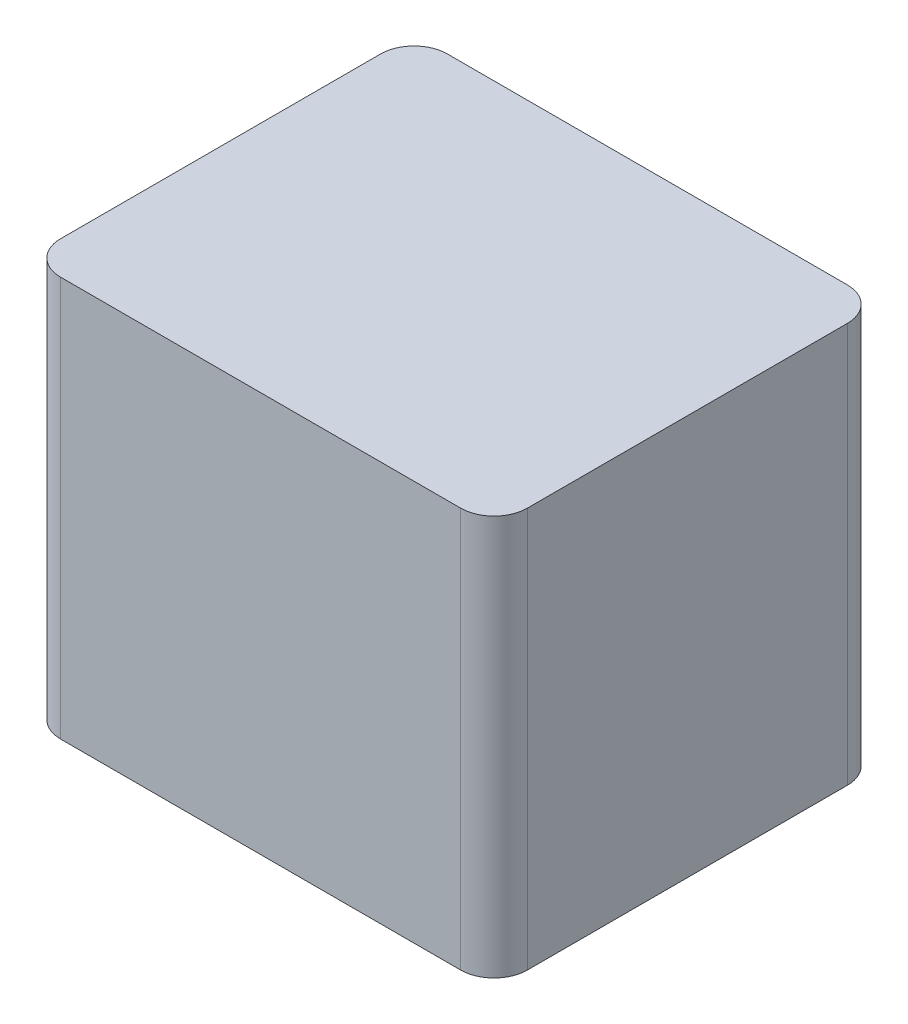
ISO-10303-21;
HEADER;
FILE_DESCRIPTION(('STEP AP214'),'2;1');
FILE_NAME('part.step','',(''),(''),'','','');
FILE_SCHEMA(('AUTOMOTIVE_DESIGN { 1 0 10303 214 1 1 1 1 }'));
ENDSEC;
DATA;
#1=APPLICATION_CONTEXT('core data for automotive mechanical design processes');
#2=APPLICATION_PROTOCOL_DEFINITION('international standard','automotive_design',2000,#1);
#3=PRODUCT_CONTEXT('',#1,'mechanical');
#4=PRODUCT('Part','Part','',(#3));
#5=PRODUCT_RELATED_PRODUCT_CATEGORY('part','',(#4));
#6=PRODUCT_DEFINITION_FORMATION('','',#4);
#7=PRODUCT_DEFINITION_CONTEXT('part definition',#1,'design');
#8=PRODUCT_DEFINITION('design','',#6,#7);
#9=PRODUCT_DEFINITION_SHAPE('','',#8);
#10=(LENGTH_UNIT() NAMED_UNIT(*) SI_UNIT(.MILLI.,.METRE.));
#11=(NAMED_UNIT(*) PLANE_ANGLE_UNIT() SI_UNIT($,.RADIAN.));
#12=(NAMED_UNIT(*) SI_UNIT($,.STERADIAN.) SOLID_ANGLE_UNIT());
#13=UNCERTAINTY_MEASURE_WITH_UNIT(LENGTH_MEASURE(1.E-05),#10,'distance_accuracy_value','');
#14=(GEOMETRIC_REPRESENTATION_CONTEXT(3) GLOBAL_UNCERTAINTY_ASSIGNED_CONTEXT((#13)) GLOBAL_UNIT_ASSIGNED_CONTEXT((#10,
#11,#12)) REPRESENTATION_CONTEXT('',''));
#15=CARTESIAN_POINT('',(0.,0.,0.));
#16=DIRECTION('',(0.,0.,1.));
#17=DIRECTION('',(1.,0.,0.));
#18=AXIS2_PLACEMENT_3D('',#15,#16,#17);
#19=CARTESIAN_POINT('',(-30.,30.,24.));
#20=DIRECTION('',(0.,-1.,0.));
#21=DIRECTION('',(0.,0.,-1.));
#22=AXIS2_PLACEMENT_3D('',#19,#20,#21);
#23=CYLINDRICAL_SURFACE('',#22,5.);
#24=CARTESIAN_POINT('',(-30.,-30.,24.));
#25=DIRECTION('',(0.,1.,0.));
#26=DIRECTION('',(0.,0.,-1.));
#27=AXIS2_PLACEMENT_3D('',#24,#25,#26);
#28=CIRCLE('',#27,5.);
#29=CARTESIAN_POINT('',(-35.,-30.,24.));
#30=VERTEX_POINT('',#29);
#31=CARTESIAN_POINT('',(-30.,-30.,29.));
#32=VERTEX_POINT('',#31);
#33=EDGE_CURVE('E133',#30,#32,#28,.T.);
#34=ORIENTED_EDGE('',*,*,#33,.T.);
#35=DIRECTION('',(0.,-1.,0.));
#36=VECTOR('',#35,1.);
#37=CARTESIAN_POINT('',(-30.,30.,29.));
#38=LINE('',#37,#36);
#39=CARTESIAN_POINT('',(-30.,30.,29.));
#40=VERTEX_POINT('',#39);
#41=EDGE_CURVE('E11',#40,#32,#38,.T.);
#42=ORIENTED_EDGE('',*,*,#41,.F.);
#43=CARTESIAN_POINT('',(-30.,30.,24.));
#44=DIRECTION('',(0.,1.,0.));
#45=DIRECTION('',(0.,0.,-1.));
#46=AXIS2_PLACEMENT_3D('',#43,#44,#45);
#47=CIRCLE('',#46,5.);
#48=CARTESIAN_POINT('',(-35.,30.,24.));
#49=VERTEX_POINT('',#48);
#50=EDGE_CURVE('E147',#49,#40,#47,.T.);
#51=ORIENTED_EDGE('',*,*,#50,.F.);
#52=DIRECTION('',(0.,-1.,0.));
#53=VECTOR('',#52,1.);
#54=CARTESIAN_POINT('',(-35.,30.,24.));
#55=LINE('',#54,#53);
#56=EDGE_CURVE('E129',#49,#30,#55,.T.);
#57=ORIENTED_EDGE('',*,*,#56,.T.);
#58=EDGE_LOOP('',(#34,#42,#51,#57));
#59=FACE_BOUND('',#58,.T.);
#60=ADVANCED_FACE('F37',(#59),#23,.T.);
#61=CARTESIAN_POINT('',(-30.,30.,29.));
#62=DIRECTION('',(0.,0.,-1.));
#63=DIRECTION('',(-1.,0.,0.));
#64=AXIS2_PLACEMENT_3D('',#61,#62,#63);
#65=PLANE('',#64);
#66=DIRECTION('',(1.,0.,0.));
#67=VECTOR('',#66,1.);
#68=CARTESIAN_POINT('',(-30.,-30.,29.));
#69=LINE('',#68,#67);
#70=CARTESIAN_POINT('',(30.,-30.,29.));
#71=VERTEX_POINT('',#70);
#72=EDGE_CURVE('E136',#32,#71,#69,.T.);
#73=ORIENTED_EDGE('',*,*,#72,.T.);
#74=DIRECTION('',(0.,-1.,0.));
#75=VECTOR('',#74,1.);
#76=CARTESIAN_POINT('',(30.,30.,29.));
#77=LINE('',#76,#75);
#78=CARTESIAN_POINT('',(30.,30.,29.));
#79=VERTEX_POINT('',#78);
#80=EDGE_CURVE('E45',#79,#71,#77,.T.);
#81=ORIENTED_EDGE('',*,*,#80,.F.);
#82=DIRECTION('',(1.,0.,0.));
#83=VECTOR('',#82,1.);
#84=CARTESIAN_POINT('',(-30.,30.,29.));
#85=LINE('',#84,#83);
#86=EDGE_CURVE('E96',#40,#79,#85,.T.);
#87=ORIENTED_EDGE('',*,*,#86,.F.);
#88=ORIENTED_EDGE('',*,*,#41,.T.);
#89=EDGE_LOOP('',(#73,#81,#87,#88));
#90=FACE_BOUND('',#89,.T.);
#91=ADVANCED_FACE('F182',(#90),#65,.F.);
#92=CARTESIAN_POINT('',(30.,30.,24.));
#93=DIRECTION('',(0.,-1.,0.));
#94=DIRECTION('',(0.,0.,-1.));
#95=AXIS2_PLACEMENT_3D('',#92,#93,#94);
#96=CYLINDRICAL_SURFACE('',#95,5.);
#97=CARTESIAN_POINT('',(30.,-30.,24.));
#98=DIRECTION('',(0.,1.,0.));
#99=DIRECTION('',(0.,0.,1.));
#100=AXIS2_PLACEMENT_3D('',#97,#98,#99);
#101=CIRCLE('',#100,5.);
#102=CARTESIAN_POINT('',(35.,-30.,24.));
#103=VERTEX_POINT('',#102);
#104=EDGE_CURVE('E138',#71,#103,#101,.T.);
#105=ORIENTED_EDGE('',*,*,#104,.T.);
#106=DIRECTION('',(0.,-1.,0.));
#107=VECTOR('',#106,1.);
#108=CARTESIAN_POINT('',(35.,30.,24.));
#109=LINE('',#108,#107);
#110=CARTESIAN_POINT('',(35.,30.,24.));
#111=VERTEX_POINT('',#110);
#112=EDGE_CURVE('E154',#111,#103,#109,.T.);
#113=ORIENTED_EDGE('',*,*,#112,.F.);
#114=CARTESIAN_POINT('',(30.,30.,24.));
#115=DIRECTION('',(0.,1.,0.));
#116=DIRECTION('',(0.,0.,1.));
#117=AXIS2_PLACEMENT_3D('',#114,#115,#116);
#118=CIRCLE('',#117,5.);
#119=EDGE_CURVE('E162',#79,#111,#118,.T.);
#120=ORIENTED_EDGE('',*,*,#119,.F.);
#121=ORIENTED_EDGE('',*,*,#80,.T.);
#122=EDGE_LOOP('',(#105,#113,#120,#121));
#123=FACE_BOUND('',#122,.T.);
#124=ADVANCED_FACE('F160',(#123),#96,.T.);
#125=CARTESIAN_POINT('',(35.,30.,24.));
#126=DIRECTION('',(-1.,0.,0.));
#127=DIRECTION('',(0.,0.,1.));
#128=AXIS2_PLACEMENT_3D('',#125,#126,#127);
#129=PLANE('',#128);
#130=DIRECTION('',(0.,0.,-1.));
#131=VECTOR('',#130,1.);
#132=CARTESIAN_POINT('',(35.,-30.,24.));
#133=LINE('',#132,#131);
#134=CARTESIAN_POINT('',(35.,-30.,-24.));
#135=VERTEX_POINT('',#134);
#136=EDGE_CURVE('E140',#103,#135,#133,.T.);
#137=ORIENTED_EDGE('',*,*,#136,.T.);
#138=DIRECTION('',(0.,-1.,0.));
#139=VECTOR('',#138,1.);
#140=CARTESIAN_POINT('',(35.,30.,-24.));
#141=LINE('',#140,#139);
#142=CARTESIAN_POINT('',(35.,30.,-24.));
#143=VERTEX_POINT('',#142);
#144=EDGE_CURVE('E151',#143,#135,#141,.T.);
#145=ORIENTED_EDGE('',*,*,#144,.F.);
#146=DIRECTION('',(0.,0.,-1.));
#147=VECTOR('',#146,1.);
#148=CARTESIAN_POINT('',(35.,30.,24.));
#149=LINE('',#148,#147);
#150=EDGE_CURVE('E174',#111,#143,#149,.T.);
#151=ORIENTED_EDGE('',*,*,#150,.F.);
#152=ORIENTED_EDGE('',*,*,#112,.T.);
#153=EDGE_LOOP('',(#137,#145,#151,#152));
#154=FACE_BOUND('',#153,.T.);
#155=ADVANCED_FACE('F170',(#154),#129,.F.);
#156=CARTESIAN_POINT('',(30.,30.,-24.));
#157=DIRECTION('',(0.,-1.,0.));
#158=DIRECTION('',(0.,0.,-1.));
#159=AXIS2_PLACEMENT_3D('',#156,#157,#158);
#160=CYLINDRICAL_SURFACE('',#159,5.);
#161=CARTESIAN_POINT('',(30.,-30.,-24.));
#162=DIRECTION('',(0.,1.,0.));
#163=DIRECTION('',(0.,0.,-1.));
#164=AXIS2_PLACEMENT_3D('',#161,#162,#163);
#165=CIRCLE('',#164,5.);
#166=CARTESIAN_POINT('',(30.,-30.,-29.));
#167=VERTEX_POINT('',#166);
#168=EDGE_CURVE('E142',#135,#167,#165,.T.);
#169=ORIENTED_EDGE('',*,*,#168,.T.);
#170=DIRECTION('',(0.,-1.,0.));
#171=VECTOR('',#170,1.);
#172=CARTESIAN_POINT('',(30.,30.,-29.));
#173=LINE('',#172,#171);
#174=CARTESIAN_POINT('',(30.,30.,-29.));
#175=VERTEX_POINT('',#174);
#176=EDGE_CURVE('E124',#175,#167,#173,.T.);
#177=ORIENTED_EDGE('',*,*,#176,.F.);
#178=CARTESIAN_POINT('',(30.,30.,-24.));
#179=DIRECTION('',(0.,1.,0.));
#180=DIRECTION('',(0.,0.,-1.));
#181=AXIS2_PLACEMENT_3D('',#178,#179,#180);
#182=CIRCLE('',#181,5.);
#183=EDGE_CURVE('E115',#143,#175,#182,.T.);
#184=ORIENTED_EDGE('',*,*,#183,.F.);
#185=ORIENTED_EDGE('',*,*,#144,.T.);
#186=EDGE_LOOP('',(#169,#177,#184,#185));
#187=FACE_BOUND('',#186,.T.);
#188=ADVANCED_FACE('F173',(#187),#160,.T.);
#189=CARTESIAN_POINT('',(-30.,30.,-29.));
#190=DIRECTION('',(0.,0.,1.));
#191=DIRECTION('',(1.,0.,0.));
#192=AXIS2_PLACEMENT_3D('',#189,#190,#191);
#193=PLANE('',#192);
#194=DIRECTION('',(-1.,0.,0.));
#195=VECTOR('',#194,1.);
#196=CARTESIAN_POINT('',(-30.,-30.,-29.));
#197=LINE('',#196,#195);
#198=CARTESIAN_POINT('',(-30.,-30.,-29.));
#199=VERTEX_POINT('',#198);
#200=EDGE_CURVE('E123',#167,#199,#197,.T.);
#201=ORIENTED_EDGE('',*,*,#200,.T.);
#202=DIRECTION('',(0.,-1.,0.));
#203=VECTOR('',#202,1.);
#204=CARTESIAN_POINT('',(-30.,30.,-29.));
#205=LINE('',#204,#203);
#206=CARTESIAN_POINT('',(-30.,30.,-29.));
#207=VERTEX_POINT('',#206);
#208=EDGE_CURVE('E120',#207,#199,#205,.T.);
#209=ORIENTED_EDGE('',*,*,#208,.F.);
#210=DIRECTION('',(-1.,0.,0.));
#211=VECTOR('',#210,1.);
#212=CARTESIAN_POINT('',(-30.,30.,-29.));
#213=LINE('',#212,#211);
#214=EDGE_CURVE('E109',#175,#207,#213,.T.);
#215=ORIENTED_EDGE('',*,*,#214,.F.);
#216=ORIENTED_EDGE('',*,*,#176,.T.);
#217=EDGE_LOOP('',(#201,#209,#215,#216));
#218=FACE_BOUND('',#217,.T.);
#219=ADVANCED_FACE('F121',(#218),#193,.F.);
#220=CARTESIAN_POINT('',(-30.,30.,-24.));
#221=DIRECTION('',(0.,-1.,0.));
#222=DIRECTION('',(0.,0.,-1.));
#223=AXIS2_PLACEMENT_3D('',#220,#221,#222);
#224=CYLINDRICAL_SURFACE('',#223,5.);
#225=CARTESIAN_POINT('',(-30.,-30.,-24.));
#226=DIRECTION('',(0.,1.,0.));
#227=DIRECTION('',(0.,0.,-1.));
#228=AXIS2_PLACEMENT_3D('',#225,#226,#227);
#229=CIRCLE('',#228,5.);
#230=CARTESIAN_POINT('',(-35.,-30.,-24.));
#231=VERTEX_POINT('',#230);
#232=EDGE_CURVE('E82',#199,#231,#229,.T.);
#233=ORIENTED_EDGE('',*,*,#232,.T.);
#234=DIRECTION('',(0.,-1.,0.));
#235=VECTOR('',#234,1.);
#236=CARTESIAN_POINT('',(-35.,30.,-24.));
#237=LINE('',#236,#235);
#238=CARTESIAN_POINT('',(-35.,30.,-24.));
#239=VERTEX_POINT('',#238);
#240=EDGE_CURVE('E125',#239,#231,#237,.T.);
#241=ORIENTED_EDGE('',*,*,#240,.F.);
#242=CARTESIAN_POINT('',(-30.,30.,-24.));
#243=DIRECTION('',(0.,1.,0.));
#244=DIRECTION('',(0.,0.,-1.));
#245=AXIS2_PLACEMENT_3D('',#242,#243,#244);
#246=CIRCLE('',#245,5.);
#247=EDGE_CURVE('E113',#207,#239,#246,.T.);
#248=ORIENTED_EDGE('',*,*,#247,.F.);
#249=ORIENTED_EDGE('',*,*,#208,.T.);
#250=EDGE_LOOP('',(#233,#241,#248,#249));
#251=FACE_BOUND('',#250,.T.);
#252=ADVANCED_FACE('F127',(#251),#224,.T.);
#253=CARTESIAN_POINT('',(-35.,30.,24.));
#254=DIRECTION('',(1.,0.,0.));
#255=DIRECTION('',(0.,0.,-1.));
#256=AXIS2_PLACEMENT_3D('',#253,#254,#255);
#257=PLANE('',#256);
#258=DIRECTION('',(0.,0.,1.));
#259=VECTOR('',#258,1.);
#260=CARTESIAN_POINT('',(-35.,-30.,24.));
#261=LINE('',#260,#259);
#262=EDGE_CURVE('E88',#231,#30,#261,.T.);
#263=ORIENTED_EDGE('',*,*,#262,.T.);
#264=ORIENTED_EDGE('',*,*,#56,.F.);
#265=DIRECTION('',(0.,0.,1.));
#266=VECTOR('',#265,1.);
#267=CARTESIAN_POINT('',(-35.,30.,24.));
#268=LINE('',#267,#266);
#269=EDGE_CURVE('E53',#239,#49,#268,.T.);
#270=ORIENTED_EDGE('',*,*,#269,.F.);
#271=ORIENTED_EDGE('',*,*,#240,.T.);
#272=EDGE_LOOP('',(#263,#264,#270,#271));
#273=FACE_BOUND('',#272,.T.);
#274=ADVANCED_FACE('F198',(#273),#257,.F.);
#275=CARTESIAN_POINT('',(-30.,30.,24.));
#276=DIRECTION('',(0.,-1.,0.));
#277=DIRECTION('',(0.,0.,-1.));
#278=AXIS2_PLACEMENT_3D('',#275,#276,#277);
#279=PLANE('',#278);
#280=ORIENTED_EDGE('',*,*,#50,.T.);
#281=ORIENTED_EDGE('',*,*,#86,.T.);
#282=ORIENTED_EDGE('',*,*,#119,.T.);
#283=ORIENTED_EDGE('',*,*,#150,.T.);
#284=ORIENTED_EDGE('',*,*,#183,.T.);
#285=ORIENTED_EDGE('',*,*,#214,.T.);
#286=ORIENTED_EDGE('',*,*,#247,.T.);
#287=ORIENTED_EDGE('',*,*,#269,.T.);
#288=EDGE_LOOP('',(#280,#281,#282,#283,#284,#285,#286,#287));
#289=FACE_BOUND('',#288,.T.);
#290=ADVANCED_FACE('F111',(#289),#279,.F.);
#291=CARTESIAN_POINT('',(-30.,-30.,24.));
#292=DIRECTION('',(0.,-1.,0.));
#293=DIRECTION('',(0.,0.,-1.));
#294=AXIS2_PLACEMENT_3D('',#291,#292,#293);
#295=PLANE('',#294);
#296=ORIENTED_EDGE('',*,*,#33,.F.);
#297=ORIENTED_EDGE('',*,*,#262,.F.);
#298=ORIENTED_EDGE('',*,*,#232,.F.);
#299=ORIENTED_EDGE('',*,*,#200,.F.);
#300=ORIENTED_EDGE('',*,*,#168,.F.);
#301=ORIENTED_EDGE('',*,*,#136,.F.);
#302=ORIENTED_EDGE('',*,*,#104,.F.);
#303=ORIENTED_EDGE('',*,*,#72,.F.);
#304=EDGE_LOOP('',(#296,#297,#298,#299,#300,#301,#302,#303));
#305=FACE_BOUND('',#304,.T.);
#306=ADVANCED_FACE('F166',(#305),#295,.T.);
#307=CLOSED_SHELL('',(#60,#91,#124,#155,#188,#219,#252,#274,#290,#306));
#308=MANIFOLD_SOLID_BREP('B2',#307);
#309=ADVANCED_BREP_SHAPE_REPRESENTATION('',(#18,#308),#14);
#310=SHAPE_DEFINITION_REPRESENTATION(#9,#309);
ENDSEC;
END-ISO-10303-21;
